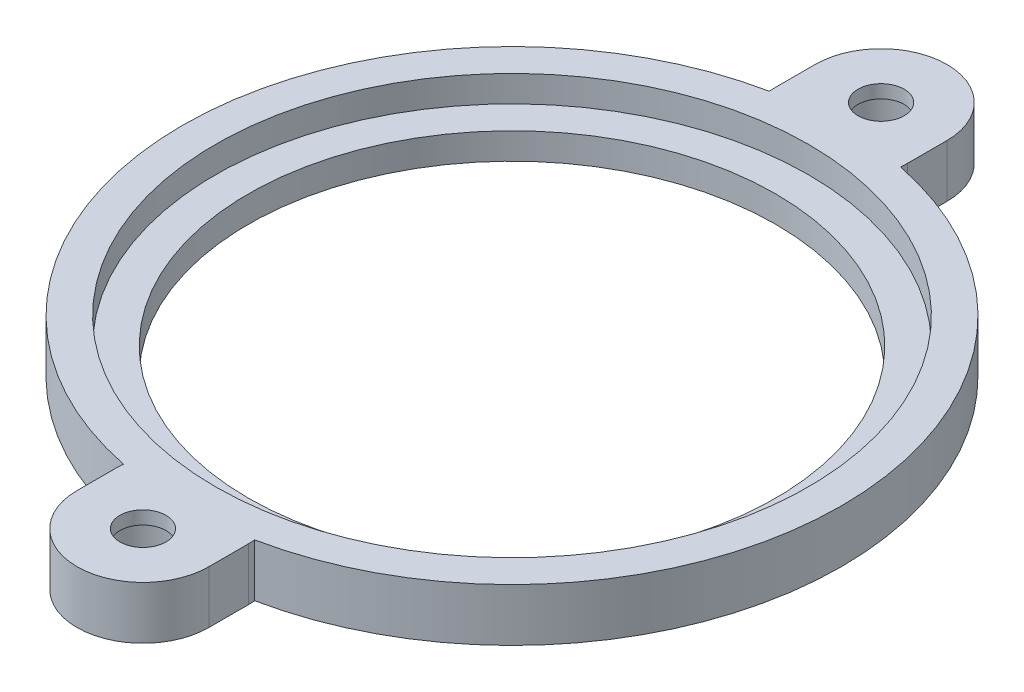
ISO-10303-21;
HEADER;
FILE_DESCRIPTION(('STEP AP214'),'2;1');
FILE_NAME('part.step','',(''),(''),'','','');
FILE_SCHEMA(('AUTOMOTIVE_DESIGN { 1 0 10303 214 1 1 1 1 }'));
ENDSEC;
DATA;
#1=APPLICATION_CONTEXT('core data for automotive mechanical design processes');
#2=APPLICATION_PROTOCOL_DEFINITION('international standard','automotive_design',2000,#1);
#3=PRODUCT_CONTEXT('',#1,'mechanical');
#4=PRODUCT('Part','Part','',(#3));
#5=PRODUCT_RELATED_PRODUCT_CATEGORY('part','',(#4));
#6=PRODUCT_DEFINITION_FORMATION('','',#4);
#7=PRODUCT_DEFINITION_CONTEXT('part definition',#1,'design');
#8=PRODUCT_DEFINITION('design','',#6,#7);
#9=PRODUCT_DEFINITION_SHAPE('','',#8);
#10=(LENGTH_UNIT() NAMED_UNIT(*) SI_UNIT(.MILLI.,.METRE.));
#11=(NAMED_UNIT(*) PLANE_ANGLE_UNIT() SI_UNIT($,.RADIAN.));
#12=(NAMED_UNIT(*) SI_UNIT($,.STERADIAN.) SOLID_ANGLE_UNIT());
#13=UNCERTAINTY_MEASURE_WITH_UNIT(LENGTH_MEASURE(1.E-05),#10,'distance_accuracy_value','');
#14=(GEOMETRIC_REPRESENTATION_CONTEXT(3) GLOBAL_UNCERTAINTY_ASSIGNED_CONTEXT((#13)) GLOBAL_UNIT_ASSIGNED_CONTEXT((#10,
#11,#12)) REPRESENTATION_CONTEXT('',''));
#15=CARTESIAN_POINT('',(0.,0.,0.));
#16=DIRECTION('',(0.,0.,1.));
#17=DIRECTION('',(1.,0.,0.));
#18=AXIS2_PLACEMENT_3D('',#15,#16,#17);
#19=CARTESIAN_POINT('',(0.,0.,28.));
#20=DIRECTION('',(0.,1.,0.));
#21=DIRECTION('',(0.,0.,1.));
#22=AXIS2_PLACEMENT_3D('',#19,#20,#21);
#23=CYLINDRICAL_SURFACE('',#22,1.75);
#24=CARTESIAN_POINT('',(0.,4.,28.));
#25=DIRECTION('',(0.,1.,0.));
#26=DIRECTION('',(0.,0.,1.));
#27=AXIS2_PLACEMENT_3D('',#24,#25,#26);
#28=CIRCLE('',#27,1.75);
#29=CARTESIAN_POINT('',(0.,4.,29.75));
#30=VERTEX_POINT('',#29);
#31=EDGE_CURVE('E212',#30,#30,#28,.T.);
#32=ORIENTED_EDGE('',*,*,#31,.T.);
#33=EDGE_LOOP('',(#32));
#34=FACE_BOUND('',#33,.T.);
#35=CARTESIAN_POINT('',(0.,3.,28.));
#36=DIRECTION('',(0.,-1.,0.));
#37=DIRECTION('',(0.,0.,-1.));
#38=AXIS2_PLACEMENT_3D('',#35,#36,#37);
#39=CIRCLE('',#38,1.75);
#40=CARTESIAN_POINT('',(0.,3.,26.25));
#41=VERTEX_POINT('',#40);
#42=EDGE_CURVE('E205',#41,#41,#39,.F.);
#43=ORIENTED_EDGE('',*,*,#42,.F.);
#44=EDGE_LOOP('',(#43));
#45=FACE_BOUND('',#44,.T.);
#46=ADVANCED_FACE('F32',(#34,#45),#23,.F.);
#47=CARTESIAN_POINT('',(0.,0.,0.));
#48=DIRECTION('',(0.,1.,0.));
#49=DIRECTION('',(0.,0.,1.));
#50=AXIS2_PLACEMENT_3D('',#47,#48,#49);
#51=CYLINDRICAL_SURFACE('',#50,20.);
#52=CARTESIAN_POINT('',(0.,0.,0.));
#53=DIRECTION('',(0.,1.,0.));
#54=DIRECTION('',(0.,0.,1.));
#55=AXIS2_PLACEMENT_3D('',#52,#53,#54);
#56=CIRCLE('',#55,20.);
#57=CARTESIAN_POINT('',(0.,0.,20.));
#58=VERTEX_POINT('',#57);
#59=EDGE_CURVE('E159',#58,#58,#56,.T.);
#60=ORIENTED_EDGE('',*,*,#59,.F.);
#61=EDGE_LOOP('',(#60));
#62=FACE_BOUND('',#61,.T.);
#63=CARTESIAN_POINT('',(0.,2.,0.));
#64=DIRECTION('',(0.,1.,0.));
#65=DIRECTION('',(0.,0.,1.));
#66=AXIS2_PLACEMENT_3D('',#63,#64,#65);
#67=CIRCLE('',#66,20.);
#68=CARTESIAN_POINT('',(0.,2.,20.));
#69=VERTEX_POINT('',#68);
#70=EDGE_CURVE('E202',#69,#69,#67,.F.);
#71=ORIENTED_EDGE('',*,*,#70,.F.);
#72=EDGE_LOOP('',(#71));
#73=FACE_BOUND('',#72,.T.);
#74=ADVANCED_FACE('F277',(#62,#73),#51,.F.);
#75=CARTESIAN_POINT('',(0.,4.,-25.));
#76=DIRECTION('',(0.,-1.,0.));
#77=DIRECTION('',(0.,0.,-1.));
#78=AXIS2_PLACEMENT_3D('',#75,#76,#77);
#79=CYLINDRICAL_SURFACE('',#78,5.);
#80=CARTESIAN_POINT('',(0.,0.,-25.));
#81=DIRECTION('',(0.,1.,0.));
#82=DIRECTION('',(0.,0.,1.));
#83=AXIS2_PLACEMENT_3D('',#80,#81,#82);
#84=CIRCLE('',#83,5.);
#85=CARTESIAN_POINT('',(-5.,0.,-25.));
#86=VERTEX_POINT('',#85);
#87=CARTESIAN_POINT('',(-4.97493718553309,0.,-24.5));
#88=VERTEX_POINT('',#87);
#89=EDGE_CURVE('E155',#86,#88,#84,.T.);
#90=ORIENTED_EDGE('',*,*,#89,.T.);
#91=DIRECTION('',(0.,-1.,0.));
#92=VECTOR('',#91,1.);
#93=CARTESIAN_POINT('',(-4.97493718553309,4.,-24.5));
#94=LINE('',#93,#92);
#95=CARTESIAN_POINT('',(-4.97493718553309,4.,-24.5));
#96=VERTEX_POINT('',#95);
#97=EDGE_CURVE('E11',#96,#88,#94,.T.);
#98=ORIENTED_EDGE('',*,*,#97,.F.);
#99=CARTESIAN_POINT('',(0.,4.,-25.));
#100=DIRECTION('',(0.,1.,0.));
#101=DIRECTION('',(0.,0.,1.));
#102=AXIS2_PLACEMENT_3D('',#99,#100,#101);
#103=CIRCLE('',#102,5.);
#104=CARTESIAN_POINT('',(-5.,4.,-25.));
#105=VERTEX_POINT('',#104);
#106=EDGE_CURVE('E178',#105,#96,#103,.T.);
#107=ORIENTED_EDGE('',*,*,#106,.F.);
#108=DIRECTION('',(0.,-1.,0.));
#109=VECTOR('',#108,1.);
#110=CARTESIAN_POINT('',(-5.,4.,-25.));
#111=LINE('',#110,#109);
#112=EDGE_CURVE('E151',#105,#86,#111,.T.);
#113=ORIENTED_EDGE('',*,*,#112,.T.);
#114=EDGE_LOOP('',(#90,#98,#107,#113));
#115=FACE_BOUND('',#114,.T.);
#116=ADVANCED_FACE('F34',(#115),#79,.T.);
#117=CARTESIAN_POINT('',(0.,4.,0.));
#118=DIRECTION('',(0.,-1.,0.));
#119=DIRECTION('',(0.,0.,-1.));
#120=AXIS2_PLACEMENT_3D('',#117,#118,#119);
#121=CYLINDRICAL_SURFACE('',#120,25.);
#122=CARTESIAN_POINT('',(0.,0.,0.));
#123=DIRECTION('',(0.,1.,0.));
#124=DIRECTION('',(0.,0.,1.));
#125=AXIS2_PLACEMENT_3D('',#122,#123,#124);
#126=CIRCLE('',#125,25.);
#127=CARTESIAN_POINT('',(-4.9749371855331,0.,24.5));
#128=VERTEX_POINT('',#127);
#129=EDGE_CURVE('E158',#88,#128,#126,.T.);
#130=ORIENTED_EDGE('',*,*,#129,.T.);
#131=DIRECTION('',(0.,-1.,0.));
#132=VECTOR('',#131,1.);
#133=CARTESIAN_POINT('',(-4.9749371855331,4.,24.5));
#134=LINE('',#133,#132);
#135=CARTESIAN_POINT('',(-4.9749371855331,4.,24.5));
#136=VERTEX_POINT('',#135);
#137=EDGE_CURVE('E42',#136,#128,#134,.T.);
#138=ORIENTED_EDGE('',*,*,#137,.F.);
#139=CARTESIAN_POINT('',(0.,4.,0.));
#140=DIRECTION('',(0.,1.,0.));
#141=DIRECTION('',(0.,0.,1.));
#142=AXIS2_PLACEMENT_3D('',#139,#140,#141);
#143=CIRCLE('',#142,25.);
#144=EDGE_CURVE('E106',#96,#136,#143,.T.);
#145=ORIENTED_EDGE('',*,*,#144,.F.);
#146=ORIENTED_EDGE('',*,*,#97,.T.);
#147=EDGE_LOOP('',(#130,#138,#145,#146));
#148=FACE_BOUND('',#147,.T.);
#149=ADVANCED_FACE('F471',(#148),#121,.T.);
#150=CARTESIAN_POINT('',(0.,4.,25.));
#151=DIRECTION('',(0.,-1.,0.));
#152=DIRECTION('',(0.,0.,-1.));
#153=AXIS2_PLACEMENT_3D('',#150,#151,#152);
#154=CYLINDRICAL_SURFACE('',#153,5.);
#155=CARTESIAN_POINT('',(0.,0.,25.));
#156=DIRECTION('',(0.,1.,0.));
#157=DIRECTION('',(0.,0.,-1.));
#158=AXIS2_PLACEMENT_3D('',#155,#156,#157);
#159=CIRCLE('',#158,5.);
#160=CARTESIAN_POINT('',(-5.,0.,25.));
#161=VERTEX_POINT('',#160);
#162=EDGE_CURVE('E161',#128,#161,#159,.T.);
#163=ORIENTED_EDGE('',*,*,#162,.T.);
#164=DIRECTION('',(0.,-1.,0.));
#165=VECTOR('',#164,1.);
#166=CARTESIAN_POINT('',(-5.,4.,25.));
#167=LINE('',#166,#165);
#168=CARTESIAN_POINT('',(-5.,4.,25.));
#169=VERTEX_POINT('',#168);
#170=EDGE_CURVE('E197',#169,#161,#167,.T.);
#171=ORIENTED_EDGE('',*,*,#170,.F.);
#172=CARTESIAN_POINT('',(0.,4.,25.));
#173=DIRECTION('',(0.,1.,0.));
#174=DIRECTION('',(0.,0.,-1.));
#175=AXIS2_PLACEMENT_3D('',#172,#173,#174);
#176=CIRCLE('',#175,5.);
#177=EDGE_CURVE('E236',#136,#169,#176,.T.);
#178=ORIENTED_EDGE('',*,*,#177,.F.);
#179=ORIENTED_EDGE('',*,*,#137,.T.);
#180=EDGE_LOOP('',(#163,#171,#178,#179));
#181=FACE_BOUND('',#180,.T.);
#182=ADVANCED_FACE('F462',(#181),#154,.T.);
#183=CARTESIAN_POINT('',(-5.,4.,25.));
#184=DIRECTION('',(1.,0.,0.));
#185=DIRECTION('',(0.,0.,-1.));
#186=AXIS2_PLACEMENT_3D('',#183,#184,#185);
#187=PLANE('',#186);
#188=DIRECTION('',(0.,0.,1.));
#189=VECTOR('',#188,1.);
#190=CARTESIAN_POINT('',(-5.,0.,25.));
#191=LINE('',#190,#189);
#192=CARTESIAN_POINT('',(-5.,0.,28.));
#193=VERTEX_POINT('',#192);
#194=EDGE_CURVE('E163',#161,#193,#191,.T.);
#195=ORIENTED_EDGE('',*,*,#194,.T.);
#196=DIRECTION('',(0.,-1.,0.));
#197=VECTOR('',#196,1.);
#198=CARTESIAN_POINT('',(-5.,4.,28.));
#199=LINE('',#198,#197);
#200=CARTESIAN_POINT('',(-5.,4.,28.));
#201=VERTEX_POINT('',#200);
#202=EDGE_CURVE('E194',#201,#193,#199,.T.);
#203=ORIENTED_EDGE('',*,*,#202,.F.);
#204=DIRECTION('',(0.,0.,1.));
#205=VECTOR('',#204,1.);
#206=CARTESIAN_POINT('',(-5.,4.,25.));
#207=LINE('',#206,#205);
#208=EDGE_CURVE('E238',#169,#201,#207,.T.);
#209=ORIENTED_EDGE('',*,*,#208,.F.);
#210=ORIENTED_EDGE('',*,*,#170,.T.);
#211=EDGE_LOOP('',(#195,#203,#209,#210));
#212=FACE_BOUND('',#211,.T.);
#213=ADVANCED_FACE('F453',(#212),#187,.F.);
#214=CARTESIAN_POINT('',(0.,4.,28.));
#215=DIRECTION('',(0.,-1.,0.));
#216=DIRECTION('',(0.,0.,-1.));
#217=AXIS2_PLACEMENT_3D('',#214,#215,#216);
#218=CYLINDRICAL_SURFACE('',#217,5.);
#219=CARTESIAN_POINT('',(0.,0.,28.));
#220=DIRECTION('',(0.,1.,0.));
#221=DIRECTION('',(0.,0.,-1.));
#222=AXIS2_PLACEMENT_3D('',#219,#220,#221);
#223=CIRCLE('',#222,5.);
#224=CARTESIAN_POINT('',(5.,0.,28.));
#225=VERTEX_POINT('',#224);
#226=EDGE_CURVE('E165',#193,#225,#223,.T.);
#227=ORIENTED_EDGE('',*,*,#226,.T.);
#228=DIRECTION('',(0.,-1.,0.));
#229=VECTOR('',#228,1.);
#230=CARTESIAN_POINT('',(5.,4.,28.));
#231=LINE('',#230,#229);
#232=CARTESIAN_POINT('',(5.,4.,28.));
#233=VERTEX_POINT('',#232);
#234=EDGE_CURVE('E191',#233,#225,#231,.T.);
#235=ORIENTED_EDGE('',*,*,#234,.F.);
#236=CARTESIAN_POINT('',(0.,4.,28.));
#237=DIRECTION('',(0.,1.,0.));
#238=DIRECTION('',(0.,0.,-1.));
#239=AXIS2_PLACEMENT_3D('',#236,#237,#238);
#240=CIRCLE('',#239,5.);
#241=EDGE_CURVE('E240',#201,#233,#240,.T.);
#242=ORIENTED_EDGE('',*,*,#241,.F.);
#243=ORIENTED_EDGE('',*,*,#202,.T.);
#244=EDGE_LOOP('',(#227,#235,#242,#243));
#245=FACE_BOUND('',#244,.T.);
#246=ADVANCED_FACE('F444',(#245),#218,.T.);
#247=CARTESIAN_POINT('',(5.,4.,25.));
#248=DIRECTION('',(-1.,0.,0.));
#249=DIRECTION('',(0.,0.,1.));
#250=AXIS2_PLACEMENT_3D('',#247,#248,#249);
#251=PLANE('',#250);
#252=DIRECTION('',(0.,0.,-1.));
#253=VECTOR('',#252,1.);
#254=CARTESIAN_POINT('',(5.,0.,25.));
#255=LINE('',#254,#253);
#256=CARTESIAN_POINT('',(5.,0.,25.));
#257=VERTEX_POINT('',#256);
#258=EDGE_CURVE('E167',#225,#257,#255,.T.);
#259=ORIENTED_EDGE('',*,*,#258,.T.);
#260=DIRECTION('',(0.,-1.,0.));
#261=VECTOR('',#260,1.);
#262=CARTESIAN_POINT('',(5.,4.,25.));
#263=LINE('',#262,#261);
#264=CARTESIAN_POINT('',(5.,4.,25.));
#265=VERTEX_POINT('',#264);
#266=EDGE_CURVE('E188',#265,#257,#263,.T.);
#267=ORIENTED_EDGE('',*,*,#266,.F.);
#268=DIRECTION('',(0.,0.,-1.));
#269=VECTOR('',#268,1.);
#270=CARTESIAN_POINT('',(5.,4.,25.));
#271=LINE('',#270,#269);
#272=EDGE_CURVE('E242',#233,#265,#271,.T.);
#273=ORIENTED_EDGE('',*,*,#272,.F.);
#274=ORIENTED_EDGE('',*,*,#234,.T.);
#275=EDGE_LOOP('',(#259,#267,#273,#274));
#276=FACE_BOUND('',#275,.T.);
#277=ADVANCED_FACE('F435',(#276),#251,.F.);
#278=CARTESIAN_POINT('',(0.,4.,25.));
#279=DIRECTION('',(0.,-1.,0.));
#280=DIRECTION('',(0.,0.,-1.));
#281=AXIS2_PLACEMENT_3D('',#278,#279,#280);
#282=CYLINDRICAL_SURFACE('',#281,5.);
#283=CARTESIAN_POINT('',(0.,0.,25.));
#284=DIRECTION('',(0.,1.,0.));
#285=DIRECTION('',(0.,0.,-1.));
#286=AXIS2_PLACEMENT_3D('',#283,#284,#285);
#287=CIRCLE('',#286,5.);
#288=CARTESIAN_POINT('',(4.9749371855331,0.,24.5));
#289=VERTEX_POINT('',#288);
#290=EDGE_CURVE('E169',#257,#289,#287,.T.);
#291=ORIENTED_EDGE('',*,*,#290,.T.);
#292=DIRECTION('',(0.,-1.,0.));
#293=VECTOR('',#292,1.);
#294=CARTESIAN_POINT('',(4.9749371855331,4.,24.5));
#295=LINE('',#294,#293);
#296=CARTESIAN_POINT('',(4.9749371855331,4.,24.5));
#297=VERTEX_POINT('',#296);
#298=EDGE_CURVE('E185',#297,#289,#295,.T.);
#299=ORIENTED_EDGE('',*,*,#298,.F.);
#300=CARTESIAN_POINT('',(0.,4.,25.));
#301=DIRECTION('',(0.,1.,0.));
#302=DIRECTION('',(0.,0.,-1.));
#303=AXIS2_PLACEMENT_3D('',#300,#301,#302);
#304=CIRCLE('',#303,5.);
#305=EDGE_CURVE('E244',#265,#297,#304,.T.);
#306=ORIENTED_EDGE('',*,*,#305,.F.);
#307=ORIENTED_EDGE('',*,*,#266,.T.);
#308=EDGE_LOOP('',(#291,#299,#306,#307));
#309=FACE_BOUND('',#308,.T.);
#310=ADVANCED_FACE('F427',(#309),#282,.T.);
#311=CARTESIAN_POINT('',(0.,4.,0.));
#312=DIRECTION('',(0.,-1.,0.));
#313=DIRECTION('',(0.,0.,-1.));
#314=AXIS2_PLACEMENT_3D('',#311,#312,#313);
#315=CYLINDRICAL_SURFACE('',#314,25.);
#316=CARTESIAN_POINT('',(0.,0.,0.));
#317=DIRECTION('',(0.,1.,0.));
#318=DIRECTION('',(0.,0.,1.));
#319=AXIS2_PLACEMENT_3D('',#316,#317,#318);
#320=CIRCLE('',#319,25.);
#321=CARTESIAN_POINT('',(4.9749371855331,0.,-24.5));
#322=VERTEX_POINT('',#321);
#323=EDGE_CURVE('E171',#289,#322,#320,.T.);
#324=ORIENTED_EDGE('',*,*,#323,.T.);
#325=DIRECTION('',(0.,-1.,0.));
#326=VECTOR('',#325,1.);
#327=CARTESIAN_POINT('',(4.9749371855331,4.,-24.5));
#328=LINE('',#327,#326);
#329=CARTESIAN_POINT('',(4.9749371855331,4.,-24.5));
#330=VERTEX_POINT('',#329);
#331=EDGE_CURVE('E182',#330,#322,#328,.T.);
#332=ORIENTED_EDGE('',*,*,#331,.F.);
#333=CARTESIAN_POINT('',(0.,4.,0.));
#334=DIRECTION('',(0.,1.,0.));
#335=DIRECTION('',(0.,0.,1.));
#336=AXIS2_PLACEMENT_3D('',#333,#334,#335);
#337=CIRCLE('',#336,25.);
#338=EDGE_CURVE('E246',#297,#330,#337,.T.);
#339=ORIENTED_EDGE('',*,*,#338,.F.);
#340=ORIENTED_EDGE('',*,*,#298,.T.);
#341=EDGE_LOOP('',(#324,#332,#339,#340));
#342=FACE_BOUND('',#341,.T.);
#343=ADVANCED_FACE('F252',(#342),#315,.T.);
#344=CARTESIAN_POINT('',(0.,4.,-25.));
#345=DIRECTION('',(0.,-1.,0.));
#346=DIRECTION('',(0.,0.,-1.));
#347=AXIS2_PLACEMENT_3D('',#344,#345,#346);
#348=CYLINDRICAL_SURFACE('',#347,5.);
#349=CARTESIAN_POINT('',(0.,0.,-25.));
#350=DIRECTION('',(0.,1.,0.));
#351=DIRECTION('',(0.,0.,1.));
#352=AXIS2_PLACEMENT_3D('',#349,#350,#351);
#353=CIRCLE('',#352,5.);
#354=CARTESIAN_POINT('',(5.,0.,-25.));
#355=VERTEX_POINT('',#354);
#356=EDGE_CURVE('E173',#322,#355,#353,.T.);
#357=ORIENTED_EDGE('',*,*,#356,.T.);
#358=DIRECTION('',(0.,-1.,0.));
#359=VECTOR('',#358,1.);
#360=CARTESIAN_POINT('',(5.,4.,-25.));
#361=LINE('',#360,#359);
#362=CARTESIAN_POINT('',(5.,4.,-25.));
#363=VERTEX_POINT('',#362);
#364=EDGE_CURVE('E146',#363,#355,#361,.T.);
#365=ORIENTED_EDGE('',*,*,#364,.F.);
#366=CARTESIAN_POINT('',(0.,4.,-25.));
#367=DIRECTION('',(0.,1.,0.));
#368=DIRECTION('',(0.,0.,1.));
#369=AXIS2_PLACEMENT_3D('',#366,#367,#368);
#370=CIRCLE('',#369,5.);
#371=EDGE_CURVE('E137',#330,#363,#370,.T.);
#372=ORIENTED_EDGE('',*,*,#371,.F.);
#373=ORIENTED_EDGE('',*,*,#331,.T.);
#374=EDGE_LOOP('',(#357,#365,#372,#373));
#375=FACE_BOUND('',#374,.T.);
#376=ADVANCED_FACE('F256',(#375),#348,.T.);
#377=CARTESIAN_POINT('',(5.,4.,-25.));
#378=DIRECTION('',(-1.,0.,0.));
#379=DIRECTION('',(0.,0.,1.));
#380=AXIS2_PLACEMENT_3D('',#377,#378,#379);
#381=PLANE('',#380);
#382=DIRECTION('',(0.,0.,-1.));
#383=VECTOR('',#382,1.);
#384=CARTESIAN_POINT('',(5.,0.,-25.));
#385=LINE('',#384,#383);
#386=CARTESIAN_POINT('',(5.,0.,-28.));
#387=VERTEX_POINT('',#386);
#388=EDGE_CURVE('E145',#355,#387,#385,.T.);
#389=ORIENTED_EDGE('',*,*,#388,.T.);
#390=DIRECTION('',(0.,-1.,0.));
#391=VECTOR('',#390,1.);
#392=CARTESIAN_POINT('',(5.,4.,-28.));
#393=LINE('',#392,#391);
#394=CARTESIAN_POINT('',(5.,4.,-28.));
#395=VERTEX_POINT('',#394);
#396=EDGE_CURVE('E142',#395,#387,#393,.T.);
#397=ORIENTED_EDGE('',*,*,#396,.F.);
#398=DIRECTION('',(0.,0.,-1.));
#399=VECTOR('',#398,1.);
#400=CARTESIAN_POINT('',(5.,4.,-25.));
#401=LINE('',#400,#399);
#402=EDGE_CURVE('E131',#363,#395,#401,.T.);
#403=ORIENTED_EDGE('',*,*,#402,.F.);
#404=ORIENTED_EDGE('',*,*,#364,.T.);
#405=EDGE_LOOP('',(#389,#397,#403,#404));
#406=FACE_BOUND('',#405,.T.);
#407=ADVANCED_FACE('F143',(#406),#381,.F.);
#408=CARTESIAN_POINT('',(0.,4.,-28.));
#409=DIRECTION('',(0.,-1.,0.));
#410=DIRECTION('',(0.,0.,-1.));
#411=AXIS2_PLACEMENT_3D('',#408,#409,#410);
#412=CYLINDRICAL_SURFACE('',#411,5.);
#413=CARTESIAN_POINT('',(0.,0.,-28.));
#414=DIRECTION('',(0.,1.,0.));
#415=DIRECTION('',(0.,0.,1.));
#416=AXIS2_PLACEMENT_3D('',#413,#414,#415);
#417=CIRCLE('',#416,5.);
#418=CARTESIAN_POINT('',(-5.,0.,-28.));
#419=VERTEX_POINT('',#418);
#420=EDGE_CURVE('E92',#387,#419,#417,.T.);
#421=ORIENTED_EDGE('',*,*,#420,.T.);
#422=DIRECTION('',(0.,-1.,0.));
#423=VECTOR('',#422,1.);
#424=CARTESIAN_POINT('',(-5.,4.,-28.));
#425=LINE('',#424,#423);
#426=CARTESIAN_POINT('',(-5.,4.,-28.));
#427=VERTEX_POINT('',#426);
#428=EDGE_CURVE('E147',#427,#419,#425,.T.);
#429=ORIENTED_EDGE('',*,*,#428,.F.);
#430=CARTESIAN_POINT('',(0.,4.,-28.));
#431=DIRECTION('',(0.,1.,0.));
#432=DIRECTION('',(0.,0.,1.));
#433=AXIS2_PLACEMENT_3D('',#430,#431,#432);
#434=CIRCLE('',#433,5.);
#435=EDGE_CURVE('E135',#395,#427,#434,.T.);
#436=ORIENTED_EDGE('',*,*,#435,.F.);
#437=ORIENTED_EDGE('',*,*,#396,.T.);
#438=EDGE_LOOP('',(#421,#429,#436,#437));
#439=FACE_BOUND('',#438,.T.);
#440=ADVANCED_FACE('F149',(#439),#412,.T.);
#441=CARTESIAN_POINT('',(-5.,4.,-25.));
#442=DIRECTION('',(1.,0.,0.));
#443=DIRECTION('',(0.,0.,-1.));
#444=AXIS2_PLACEMENT_3D('',#441,#442,#443);
#445=PLANE('',#444);
#446=DIRECTION('',(0.,0.,1.));
#447=VECTOR('',#446,1.);
#448=CARTESIAN_POINT('',(-5.,0.,-25.));
#449=LINE('',#448,#447);
#450=EDGE_CURVE('E98',#419,#86,#449,.T.);
#451=ORIENTED_EDGE('',*,*,#450,.T.);
#452=ORIENTED_EDGE('',*,*,#112,.F.);
#453=DIRECTION('',(0.,0.,1.));
#454=VECTOR('',#453,1.);
#455=CARTESIAN_POINT('',(-5.,4.,-25.));
#456=LINE('',#455,#454);
#457=EDGE_CURVE('E51',#427,#105,#456,.T.);
#458=ORIENTED_EDGE('',*,*,#457,.F.);
#459=ORIENTED_EDGE('',*,*,#428,.T.);
#460=EDGE_LOOP('',(#451,#452,#458,#459));
#461=FACE_BOUND('',#460,.T.);
#462=ADVANCED_FACE('F264',(#461),#445,.F.);
#463=CARTESIAN_POINT('',(0.,4.,-25.));
#464=DIRECTION('',(0.,1.,0.));
#465=DIRECTION('',(0.,0.,1.));
#466=AXIS2_PLACEMENT_3D('',#463,#464,#465);
#467=PLANE('',#466);
#468=CARTESIAN_POINT('',(0.,4.,-28.));
#469=DIRECTION('',(0.,1.,0.));
#470=DIRECTION('',(0.,0.,-1.));
#471=AXIS2_PLACEMENT_3D('',#468,#469,#470);
#472=CIRCLE('',#471,1.75);
#473=CARTESIAN_POINT('',(0.,4.,-29.75));
#474=VERTEX_POINT('',#473);
#475=EDGE_CURVE('E207',#474,#474,#472,.T.);
#476=ORIENTED_EDGE('',*,*,#475,.F.);
#477=EDGE_LOOP('',(#476));
#478=FACE_BOUND('',#477,.T.);
#479=ORIENTED_EDGE('',*,*,#31,.F.);
#480=EDGE_LOOP('',(#479));
#481=FACE_BOUND('',#480,.T.);
#482=CARTESIAN_POINT('',(0.,4.,0.));
#483=DIRECTION('',(0.,1.,0.));
#484=DIRECTION('',(0.,0.,1.));
#485=AXIS2_PLACEMENT_3D('',#482,#483,#484);
#486=CIRCLE('',#485,22.5);
#487=CARTESIAN_POINT('',(0.,4.,22.5));
#488=VERTEX_POINT('',#487);
#489=EDGE_CURVE('E227',#488,#488,#486,.T.);
#490=ORIENTED_EDGE('',*,*,#489,.F.);
#491=EDGE_LOOP('',(#490));
#492=FACE_BOUND('',#491,.T.);
#493=ORIENTED_EDGE('',*,*,#106,.T.);
#494=ORIENTED_EDGE('',*,*,#144,.T.);
#495=ORIENTED_EDGE('',*,*,#177,.T.);
#496=ORIENTED_EDGE('',*,*,#208,.T.);
#497=ORIENTED_EDGE('',*,*,#241,.T.);
#498=ORIENTED_EDGE('',*,*,#272,.T.);
#499=ORIENTED_EDGE('',*,*,#305,.T.);
#500=ORIENTED_EDGE('',*,*,#338,.T.);
#501=ORIENTED_EDGE('',*,*,#371,.T.);
#502=ORIENTED_EDGE('',*,*,#402,.T.);
#503=ORIENTED_EDGE('',*,*,#435,.T.);
#504=ORIENTED_EDGE('',*,*,#457,.T.);
#505=EDGE_LOOP('',(#493,#494,#495,#496,#497,#498,#499,#500,#501,#502,#503,#504));
#506=FACE_BOUND('',#505,.T.);
#507=ADVANCED_FACE('F133',(#478,#481,#492,#506),#467,.T.);
#508=CARTESIAN_POINT('',(0.,0.,-25.));
#509=DIRECTION('',(0.,1.,0.));
#510=DIRECTION('',(0.,0.,1.));
#511=AXIS2_PLACEMENT_3D('',#508,#509,#510);
#512=PLANE('',#511);
#513=CARTESIAN_POINT('',(0.,0.,-28.));
#514=DIRECTION('',(0.,-1.,0.));
#515=DIRECTION('',(0.,0.,1.));
#516=AXIS2_PLACEMENT_3D('',#513,#514,#515);
#517=CIRCLE('',#516,3.25);
#518=CARTESIAN_POINT('',(0.,0.,-24.75));
#519=VERTEX_POINT('',#518);
#520=EDGE_CURVE('E222',#519,#519,#517,.T.);
#521=ORIENTED_EDGE('',*,*,#520,.F.);
#522=EDGE_LOOP('',(#521));
#523=FACE_BOUND('',#522,.T.);
#524=CARTESIAN_POINT('',(0.,0.,28.));
#525=DIRECTION('',(0.,-1.,0.));
#526=DIRECTION('',(0.,0.,-1.));
#527=AXIS2_PLACEMENT_3D('',#524,#525,#526);
#528=CIRCLE('',#527,3.25);
#529=CARTESIAN_POINT('',(0.,0.,24.75));
#530=VERTEX_POINT('',#529);
#531=EDGE_CURVE('E215',#530,#530,#528,.T.);
#532=ORIENTED_EDGE('',*,*,#531,.F.);
#533=EDGE_LOOP('',(#532));
#534=FACE_BOUND('',#533,.T.);
#535=ORIENTED_EDGE('',*,*,#59,.T.);
#536=EDGE_LOOP('',(#535));
#537=FACE_BOUND('',#536,.T.);
#538=ORIENTED_EDGE('',*,*,#89,.F.);
#539=ORIENTED_EDGE('',*,*,#450,.F.);
#540=ORIENTED_EDGE('',*,*,#420,.F.);
#541=ORIENTED_EDGE('',*,*,#388,.F.);
#542=ORIENTED_EDGE('',*,*,#356,.F.);
#543=ORIENTED_EDGE('',*,*,#323,.F.);
#544=ORIENTED_EDGE('',*,*,#290,.F.);
#545=ORIENTED_EDGE('',*,*,#258,.F.);
#546=ORIENTED_EDGE('',*,*,#226,.F.);
#547=ORIENTED_EDGE('',*,*,#194,.F.);
#548=ORIENTED_EDGE('',*,*,#162,.F.);
#549=ORIENTED_EDGE('',*,*,#129,.F.);
#550=EDGE_LOOP('',(#538,#539,#540,#541,#542,#543,#544,#545,#546,#547,#548,#549));
#551=FACE_BOUND('',#550,.T.);
#552=ADVANCED_FACE('F259',(#523,#534,#537,#551),#512,.F.);
#553=CARTESIAN_POINT('',(0.,2.,0.));
#554=DIRECTION('',(0.,1.,0.));
#555=DIRECTION('',(0.,0.,1.));
#556=AXIS2_PLACEMENT_3D('',#553,#554,#555);
#557=PLANE('',#556);
#558=CARTESIAN_POINT('',(0.,2.,0.));
#559=DIRECTION('',(0.,1.,0.));
#560=DIRECTION('',(0.,0.,1.));
#561=AXIS2_PLACEMENT_3D('',#558,#559,#560);
#562=CIRCLE('',#561,22.5);
#563=CARTESIAN_POINT('',(0.,2.,22.5));
#564=VERTEX_POINT('',#563);
#565=EDGE_CURVE('E204',#564,#564,#562,.T.);
#566=ORIENTED_EDGE('',*,*,#565,.T.);
#567=EDGE_LOOP('',(#566));
#568=FACE_BOUND('',#567,.T.);
#569=ORIENTED_EDGE('',*,*,#70,.T.);
#570=EDGE_LOOP('',(#569));
#571=FACE_BOUND('',#570,.T.);
#572=ADVANCED_FACE('F291',(#568,#571),#557,.T.);
#573=CARTESIAN_POINT('',(0.,2.,0.));
#574=DIRECTION('',(0.,1.,0.));
#575=DIRECTION('',(0.,0.,1.));
#576=AXIS2_PLACEMENT_3D('',#573,#574,#575);
#577=CYLINDRICAL_SURFACE('',#576,22.5);
#578=ORIENTED_EDGE('',*,*,#565,.F.);
#579=EDGE_LOOP('',(#578));
#580=FACE_BOUND('',#579,.T.);
#581=ORIENTED_EDGE('',*,*,#489,.T.);
#582=EDGE_LOOP('',(#581));
#583=FACE_BOUND('',#582,.T.);
#584=ADVANCED_FACE('F294',(#580,#583),#577,.F.);
#585=CARTESIAN_POINT('',(0.,0.,-28.));
#586=DIRECTION('',(0.,1.,0.));
#587=DIRECTION('',(0.,0.,1.));
#588=AXIS2_PLACEMENT_3D('',#585,#586,#587);
#589=CYLINDRICAL_SURFACE('',#588,1.75);
#590=CARTESIAN_POINT('',(0.,3.,-28.));
#591=DIRECTION('',(0.,1.,0.));
#592=DIRECTION('',(0.,0.,1.));
#593=AXIS2_PLACEMENT_3D('',#590,#591,#592);
#594=CIRCLE('',#593,1.75);
#595=CARTESIAN_POINT('',(0.,3.,-26.25));
#596=VERTEX_POINT('',#595);
#597=EDGE_CURVE('E36',#596,#596,#594,.F.);
#598=ORIENTED_EDGE('',*,*,#597,.T.);
#599=EDGE_LOOP('',(#598));
#600=FACE_BOUND('',#599,.T.);
#601=ORIENTED_EDGE('',*,*,#475,.T.);
#602=EDGE_LOOP('',(#601));
#603=FACE_BOUND('',#602,.T.);
#604=ADVANCED_FACE('F289',(#600,#603),#589,.F.);
#605=CARTESIAN_POINT('',(0.,3.,28.));
#606=DIRECTION('',(0.,-1.,0.));
#607=DIRECTION('',(0.,0.,-1.));
#608=AXIS2_PLACEMENT_3D('',#605,#606,#607);
#609=PLANE('',#608);
#610=CARTESIAN_POINT('',(0.,3.,28.));
#611=DIRECTION('',(0.,-1.,0.));
#612=DIRECTION('',(0.,0.,-1.));
#613=AXIS2_PLACEMENT_3D('',#610,#611,#612);
#614=CIRCLE('',#613,3.25);
#615=CARTESIAN_POINT('',(0.,3.,24.75));
#616=VERTEX_POINT('',#615);
#617=EDGE_CURVE('E208',#616,#616,#614,.T.);
#618=ORIENTED_EDGE('',*,*,#617,.T.);
#619=EDGE_LOOP('',(#618));
#620=FACE_BOUND('',#619,.T.);
#621=ORIENTED_EDGE('',*,*,#42,.T.);
#622=EDGE_LOOP('',(#621));
#623=FACE_BOUND('',#622,.T.);
#624=ADVANCED_FACE('F315',(#620,#623),#609,.T.);
#625=CARTESIAN_POINT('',(0.,3.,28.));
#626=DIRECTION('',(0.,-1.,0.));
#627=DIRECTION('',(0.,0.,-1.));
#628=AXIS2_PLACEMENT_3D('',#625,#626,#627);
#629=CYLINDRICAL_SURFACE('',#628,3.25);
#630=ORIENTED_EDGE('',*,*,#617,.F.);
#631=EDGE_LOOP('',(#630));
#632=FACE_BOUND('',#631,.T.);
#633=ORIENTED_EDGE('',*,*,#531,.T.);
#634=EDGE_LOOP('',(#633));
#635=FACE_BOUND('',#634,.T.);
#636=ADVANCED_FACE('F312',(#632,#635),#629,.F.);
#637=CARTESIAN_POINT('',(0.,3.,-28.));
#638=DIRECTION('',(0.,1.,0.));
#639=DIRECTION('',(0.,0.,1.));
#640=AXIS2_PLACEMENT_3D('',#637,#638,#639);
#641=PLANE('',#640);
#642=CARTESIAN_POINT('',(0.,3.,-28.));
#643=DIRECTION('',(0.,-1.,0.));
#644=DIRECTION('',(0.,0.,1.));
#645=AXIS2_PLACEMENT_3D('',#642,#643,#644);
#646=CIRCLE('',#645,3.25);
#647=CARTESIAN_POINT('',(0.,3.,-24.75));
#648=VERTEX_POINT('',#647);
#649=EDGE_CURVE('E333',#648,#648,#646,.T.);
#650=ORIENTED_EDGE('',*,*,#649,.T.);
#651=EDGE_LOOP('',(#650));
#652=FACE_BOUND('',#651,.T.);
#653=ORIENTED_EDGE('',*,*,#597,.F.);
#654=EDGE_LOOP('',(#653));
#655=FACE_BOUND('',#654,.T.);
#656=ADVANCED_FACE('F314',(#652,#655),#641,.F.);
#657=CARTESIAN_POINT('',(0.,3.,-28.));
#658=DIRECTION('',(0.,-1.,0.));
#659=DIRECTION('',(0.,0.,-1.));
#660=AXIS2_PLACEMENT_3D('',#657,#658,#659);
#661=CYLINDRICAL_SURFACE('',#660,3.25);
#662=ORIENTED_EDGE('',*,*,#649,.F.);
#663=EDGE_LOOP('',(#662));
#664=FACE_BOUND('',#663,.T.);
#665=ORIENTED_EDGE('',*,*,#520,.T.);
#666=EDGE_LOOP('',(#665));
#667=FACE_BOUND('',#666,.T.);
#668=ADVANCED_FACE('F321',(#664,#667),#661,.F.);
#669=CLOSED_SHELL('',(#46,#74,#116,#149,#182,#213,#246,#277,#310,#343,#376,#407,#440,#462,#507,
#552,#572,#584,#604,#624,#636,#656,#668));
#670=MANIFOLD_SOLID_BREP('B2',#669);
#671=ADVANCED_BREP_SHAPE_REPRESENTATION('',(#18,#670),#14);
#672=SHAPE_DEFINITION_REPRESENTATION(#9,#671);
ENDSEC;
END-ISO-10303-21;
